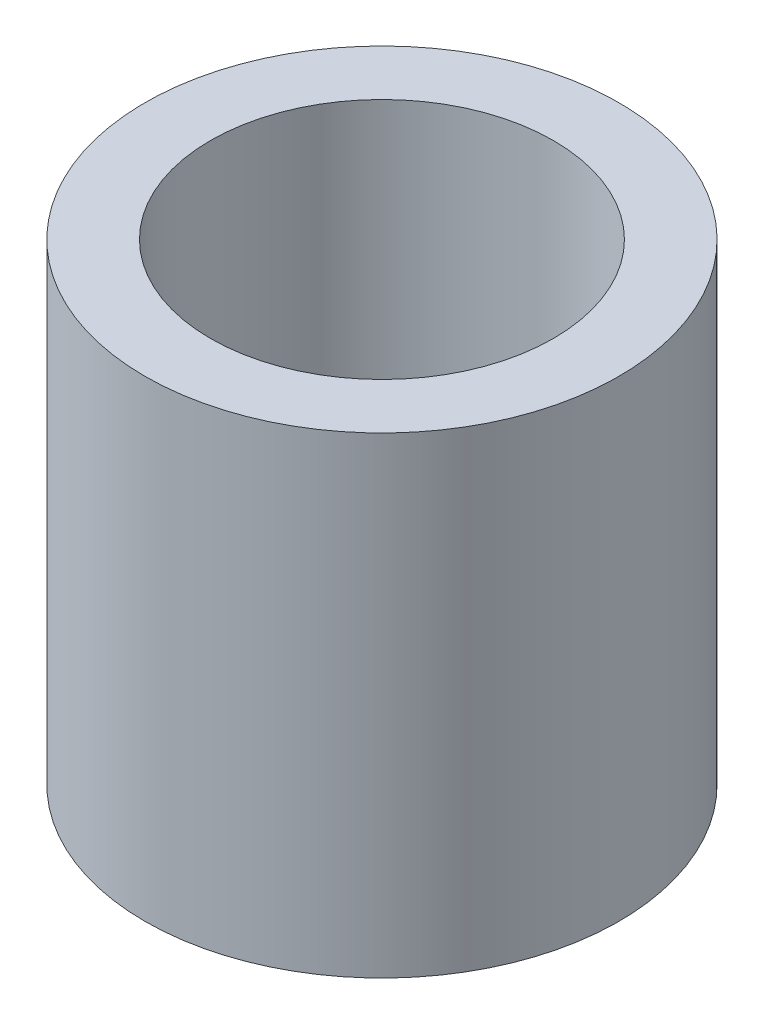
ISO-10303-21;
HEADER;
FILE_DESCRIPTION(('STEP AP214'),'2;1');
FILE_NAME('part.step','',(''),(''),'','','');
FILE_SCHEMA(('AUTOMOTIVE_DESIGN { 1 0 10303 214 1 1 1 1 }'));
ENDSEC;
DATA;
#1=APPLICATION_CONTEXT('core data for automotive mechanical design processes');
#2=APPLICATION_PROTOCOL_DEFINITION('international standard','automotive_design',2000,#1);
#3=PRODUCT_CONTEXT('',#1,'mechanical');
#4=PRODUCT('Part','Part','',(#3));
#5=PRODUCT_RELATED_PRODUCT_CATEGORY('part','',(#4));
#6=PRODUCT_DEFINITION_FORMATION('','',#4);
#7=PRODUCT_DEFINITION_CONTEXT('part definition',#1,'design');
#8=PRODUCT_DEFINITION('design','',#6,#7);
#9=PRODUCT_DEFINITION_SHAPE('','',#8);
#10=(LENGTH_UNIT() NAMED_UNIT(*) SI_UNIT(.MILLI.,.METRE.));
#11=(NAMED_UNIT(*) PLANE_ANGLE_UNIT() SI_UNIT($,.RADIAN.));
#12=(NAMED_UNIT(*) SI_UNIT($,.STERADIAN.) SOLID_ANGLE_UNIT());
#13=UNCERTAINTY_MEASURE_WITH_UNIT(LENGTH_MEASURE(1.E-05),#10,'distance_accuracy_value','');
#14=(GEOMETRIC_REPRESENTATION_CONTEXT(3) GLOBAL_UNCERTAINTY_ASSIGNED_CONTEXT((#13)) GLOBAL_UNIT_ASSIGNED_CONTEXT((#10,
#11,#12)) REPRESENTATION_CONTEXT('',''));
#15=CARTESIAN_POINT('',(0.,0.,0.));
#16=DIRECTION('',(0.,0.,1.));
#17=DIRECTION('',(1.,0.,0.));
#18=AXIS2_PLACEMENT_3D('',#15,#16,#17);
#19=CARTESIAN_POINT('',(0.,24.5,0.));
#20=DIRECTION('',(0.,-1.,0.));
#21=DIRECTION('',(0.,0.,-1.));
#22=AXIS2_PLACEMENT_3D('',#19,#20,#21);
#23=CYLINDRICAL_SURFACE('',#22,12.3);
#24=CARTESIAN_POINT('',(0.,24.5,0.));
#25=DIRECTION('',(0.,1.,0.));
#26=DIRECTION('',(0.,0.,1.));
#27=AXIS2_PLACEMENT_3D('',#24,#25,#26);
#28=CIRCLE('',#27,12.3);
#29=CARTESIAN_POINT('',(0.,24.5,12.3));
#30=VERTEX_POINT('',#29);
#31=EDGE_CURVE('E10',#30,#30,#28,.T.);
#32=ORIENTED_EDGE('',*,*,#31,.F.);
#33=EDGE_LOOP('',(#32));
#34=FACE_BOUND('',#33,.T.);
#35=CARTESIAN_POINT('',(0.,0.,0.));
#36=DIRECTION('',(0.,1.,0.));
#37=DIRECTION('',(0.,0.,1.));
#38=AXIS2_PLACEMENT_3D('',#35,#36,#37);
#39=CIRCLE('',#38,12.3);
#40=CARTESIAN_POINT('',(0.,0.,12.3));
#41=VERTEX_POINT('',#40);
#42=EDGE_CURVE('E38',#41,#41,#39,.T.);
#43=ORIENTED_EDGE('',*,*,#42,.T.);
#44=EDGE_LOOP('',(#43));
#45=FACE_BOUND('',#44,.T.);
#46=ADVANCED_FACE('F31',(#34,#45),#23,.T.);
#47=CARTESIAN_POINT('',(0.,24.5,0.));
#48=DIRECTION('',(0.,1.,0.));
#49=DIRECTION('',(0.,0.,1.));
#50=AXIS2_PLACEMENT_3D('',#47,#48,#49);
#51=PLANE('',#50);
#52=CARTESIAN_POINT('',(0.,24.5,0.));
#53=DIRECTION('',(0.,1.,0.));
#54=DIRECTION('',(0.,0.,1.));
#55=AXIS2_PLACEMENT_3D('',#52,#53,#54);
#56=CIRCLE('',#55,8.9);
#57=CARTESIAN_POINT('',(0.,24.5,8.9));
#58=VERTEX_POINT('',#57);
#59=EDGE_CURVE('E45',#58,#58,#56,.T.);
#60=ORIENTED_EDGE('',*,*,#59,.F.);
#61=EDGE_LOOP('',(#60));
#62=FACE_BOUND('',#61,.T.);
#63=ORIENTED_EDGE('',*,*,#31,.T.);
#64=EDGE_LOOP('',(#63));
#65=FACE_BOUND('',#64,.T.);
#66=ADVANCED_FACE('F79',(#62,#65),#51,.T.);
#67=CARTESIAN_POINT('',(0.,0.,0.));
#68=DIRECTION('',(0.,1.,0.));
#69=DIRECTION('',(0.,0.,1.));
#70=AXIS2_PLACEMENT_3D('',#67,#68,#69);
#71=PLANE('',#70);
#72=CARTESIAN_POINT('',(0.,0.,0.));
#73=DIRECTION('',(0.,-1.,0.));
#74=DIRECTION('',(0.,0.,-1.));
#75=AXIS2_PLACEMENT_3D('',#72,#73,#74);
#76=CIRCLE('',#75,7.4);
#77=CARTESIAN_POINT('',(0.,0.,-7.4));
#78=VERTEX_POINT('',#77);
#79=EDGE_CURVE('E51',#78,#78,#76,.T.);
#80=ORIENTED_EDGE('',*,*,#79,.F.);
#81=EDGE_LOOP('',(#80));
#82=FACE_BOUND('',#81,.T.);
#83=ORIENTED_EDGE('',*,*,#42,.F.);
#84=EDGE_LOOP('',(#83));
#85=FACE_BOUND('',#84,.T.);
#86=ADVANCED_FACE('F75',(#82,#85),#71,.F.);
#87=CARTESIAN_POINT('',(0.,4.5,0.));
#88=DIRECTION('',(0.,1.,0.));
#89=DIRECTION('',(0.,0.,1.));
#90=AXIS2_PLACEMENT_3D('',#87,#88,#89);
#91=CYLINDRICAL_SURFACE('',#90,8.9);
#92=CARTESIAN_POINT('',(0.,4.5,0.));
#93=DIRECTION('',(0.,1.,0.));
#94=DIRECTION('',(0.,0.,1.));
#95=AXIS2_PLACEMENT_3D('',#92,#93,#94);
#96=CIRCLE('',#95,8.9);
#97=CARTESIAN_POINT('',(0.,4.5,8.9));
#98=VERTEX_POINT('',#97);
#99=EDGE_CURVE('E43',#98,#98,#96,.T.);
#100=ORIENTED_EDGE('',*,*,#99,.F.);
#101=EDGE_LOOP('',(#100));
#102=FACE_BOUND('',#101,.T.);
#103=ORIENTED_EDGE('',*,*,#59,.T.);
#104=EDGE_LOOP('',(#103));
#105=FACE_BOUND('',#104,.T.);
#106=ADVANCED_FACE('F69',(#102,#105),#91,.F.);
#107=CARTESIAN_POINT('',(0.,4.5,0.));
#108=DIRECTION('',(0.,1.,0.));
#109=DIRECTION('',(0.,0.,1.));
#110=AXIS2_PLACEMENT_3D('',#107,#108,#109);
#111=PLANE('',#110);
#112=CARTESIAN_POINT('',(0.,4.5,0.));
#113=DIRECTION('',(0.,1.,0.));
#114=DIRECTION('',(0.,0.,1.));
#115=AXIS2_PLACEMENT_3D('',#112,#113,#114);
#116=CIRCLE('',#115,4.5);
#117=CARTESIAN_POINT('',(0.,4.5,4.5));
#118=VERTEX_POINT('',#117);
#119=EDGE_CURVE('E34',#118,#118,#116,.T.);
#120=ORIENTED_EDGE('',*,*,#119,.F.);
#121=EDGE_LOOP('',(#120));
#122=FACE_BOUND('',#121,.T.);
#123=ORIENTED_EDGE('',*,*,#99,.T.);
#124=EDGE_LOOP('',(#123));
#125=FACE_BOUND('',#124,.T.);
#126=ADVANCED_FACE('F65',(#122,#125),#111,.T.);
#127=CARTESIAN_POINT('',(0.,1.,0.));
#128=DIRECTION('',(0.,-1.,0.));
#129=DIRECTION('',(0.,0.,-1.));
#130=AXIS2_PLACEMENT_3D('',#127,#128,#129);
#131=CYLINDRICAL_SURFACE('',#130,7.4);
#132=CARTESIAN_POINT('',(0.,1.,0.));
#133=DIRECTION('',(0.,-1.,0.));
#134=DIRECTION('',(0.,0.,-1.));
#135=AXIS2_PLACEMENT_3D('',#132,#133,#134);
#136=CIRCLE('',#135,7.4);
#137=CARTESIAN_POINT('',(0.,1.,-7.4));
#138=VERTEX_POINT('',#137);
#139=EDGE_CURVE('E48',#138,#138,#136,.T.);
#140=ORIENTED_EDGE('',*,*,#139,.F.);
#141=EDGE_LOOP('',(#140));
#142=FACE_BOUND('',#141,.T.);
#143=ORIENTED_EDGE('',*,*,#79,.T.);
#144=EDGE_LOOP('',(#143));
#145=FACE_BOUND('',#144,.T.);
#146=ADVANCED_FACE('F68',(#142,#145),#131,.F.);
#147=CARTESIAN_POINT('',(0.,1.,0.));
#148=DIRECTION('',(0.,-1.,0.));
#149=DIRECTION('',(0.,0.,-1.));
#150=AXIS2_PLACEMENT_3D('',#147,#148,#149);
#151=PLANE('',#150);
#152=CARTESIAN_POINT('',(0.,1.,0.));
#153=DIRECTION('',(0.,-1.,0.));
#154=DIRECTION('',(0.,0.,-1.));
#155=AXIS2_PLACEMENT_3D('',#152,#153,#154);
#156=CIRCLE('',#155,4.5);
#157=CARTESIAN_POINT('',(0.,1.,-4.5));
#158=VERTEX_POINT('',#157);
#159=EDGE_CURVE('E56',#158,#158,#156,.T.);
#160=ORIENTED_EDGE('',*,*,#159,.F.);
#161=EDGE_LOOP('',(#160));
#162=FACE_BOUND('',#161,.T.);
#163=ORIENTED_EDGE('',*,*,#139,.T.);
#164=EDGE_LOOP('',(#163));
#165=FACE_BOUND('',#164,.T.);
#166=ADVANCED_FACE('F91',(#162,#165),#151,.T.);
#167=CARTESIAN_POINT('',(0.,24.5,0.));
#168=DIRECTION('',(0.,-1.,0.));
#169=DIRECTION('',(0.,0.,-1.));
#170=AXIS2_PLACEMENT_3D('',#167,#168,#169);
#171=CYLINDRICAL_SURFACE('',#170,4.5);
#172=ORIENTED_EDGE('',*,*,#119,.T.);
#173=EDGE_LOOP('',(#172));
#174=FACE_BOUND('',#173,.T.);
#175=ORIENTED_EDGE('',*,*,#159,.T.);
#176=EDGE_LOOP('',(#175));
#177=FACE_BOUND('',#176,.T.);
#178=ADVANCED_FACE('F63',(#174,#177),#171,.F.);
#179=CLOSED_SHELL('',(#46,#66,#86,#106,#126,#146,#166,#178));
#180=MANIFOLD_SOLID_BREP('B2',#179);
#181=ADVANCED_BREP_SHAPE_REPRESENTATION('',(#18,#180),#14);
#182=SHAPE_DEFINITION_REPRESENTATION(#9,#181);
ENDSEC;
END-ISO-10303-21;
